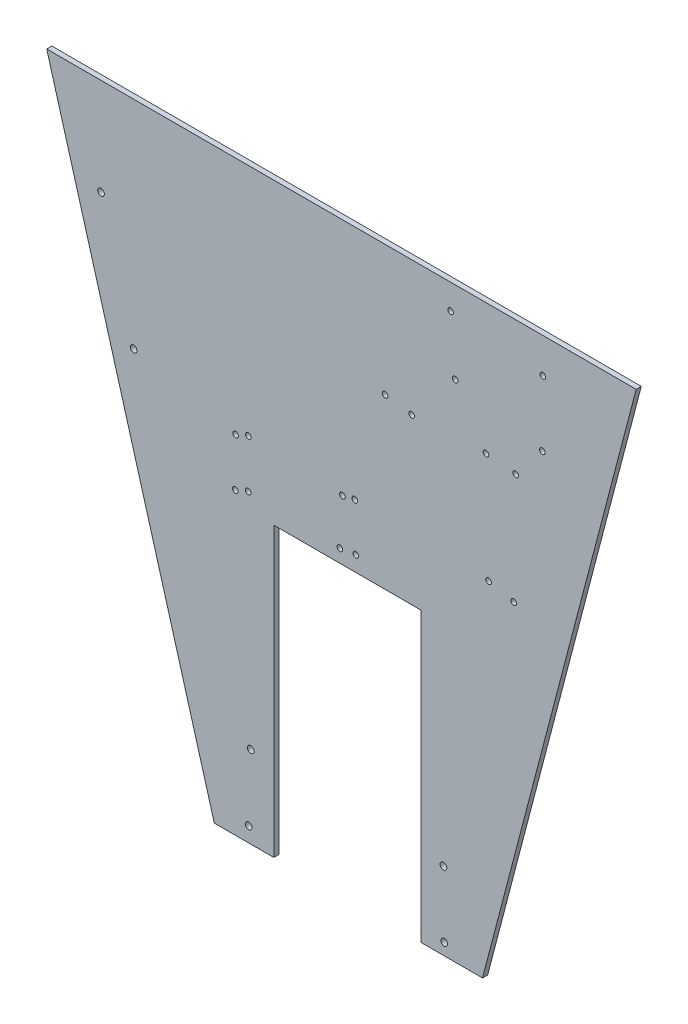
ISO-10303-21;
HEADER;
FILE_DESCRIPTION(('STEP AP214'),'2;1');
FILE_NAME('part.step','',(''),(''),'','','');
FILE_SCHEMA(('AUTOMOTIVE_DESIGN { 1 0 10303 214 1 1 1 1 }'));
ENDSEC;
DATA;
#1=APPLICATION_CONTEXT('core data for automotive mechanical design processes');
#2=APPLICATION_PROTOCOL_DEFINITION('international standard','automotive_design',2000,#1);
#3=PRODUCT_CONTEXT('',#1,'mechanical');
#4=PRODUCT('Part','Part','',(#3));
#5=PRODUCT_RELATED_PRODUCT_CATEGORY('part','',(#4));
#6=PRODUCT_DEFINITION_FORMATION('','',#4);
#7=PRODUCT_DEFINITION_CONTEXT('part definition',#1,'design');
#8=PRODUCT_DEFINITION('design','',#6,#7);
#9=PRODUCT_DEFINITION_SHAPE('','',#8);
#10=(LENGTH_UNIT() NAMED_UNIT(*) SI_UNIT(.MILLI.,.METRE.));
#11=(NAMED_UNIT(*) PLANE_ANGLE_UNIT() SI_UNIT($,.RADIAN.));
#12=(NAMED_UNIT(*) SI_UNIT($,.STERADIAN.) SOLID_ANGLE_UNIT());
#13=UNCERTAINTY_MEASURE_WITH_UNIT(LENGTH_MEASURE(1.E-05),#10,'distance_accuracy_value','');
#14=(GEOMETRIC_REPRESENTATION_CONTEXT(3) GLOBAL_UNCERTAINTY_ASSIGNED_CONTEXT((#13)) GLOBAL_UNIT_ASSIGNED_CONTEXT((#10,
#11,#12)) REPRESENTATION_CONTEXT('',''));
#15=CARTESIAN_POINT('',(0.,0.,0.));
#16=DIRECTION('',(0.,0.,1.));
#17=DIRECTION('',(1.,0.,0.));
#18=AXIS2_PLACEMENT_3D('',#15,#16,#17);
#19=CARTESIAN_POINT('',(0.,0.,5.));
#20=DIRECTION('',(0.,0.,1.));
#21=DIRECTION('',(1.,0.,0.));
#22=AXIS2_PLACEMENT_3D('',#19,#20,#21);
#23=PLANE('',#22);
#24=DIRECTION('',(0.,-1.,0.));
#25=VECTOR('',#24,1.);
#26=CARTESIAN_POINT('',(75.,0.,5.));
#27=LINE('',#26,#25);
#28=CARTESIAN_POINT('',(75.,-81.5,5.));
#29=VERTEX_POINT('',#28);
#30=CARTESIAN_POINT('',(75.,-362.25,5.));
#31=VERTEX_POINT('',#30);
#32=EDGE_CURVE('E91',#29,#31,#27,.T.);
#33=ORIENTED_EDGE('',*,*,#32,.T.);
#34=DIRECTION('',(1.,0.,0.));
#35=VECTOR('',#34,1.);
#36=CARTESIAN_POINT('',(75.,-362.25,5.));
#37=LINE('',#36,#35);
#38=CARTESIAN_POINT('',(135.125,-362.25,5.));
#39=VERTEX_POINT('',#38);
#40=EDGE_CURVE('E95',#31,#39,#37,.T.);
#41=ORIENTED_EDGE('',*,*,#40,.T.);
#42=DIRECTION('',(0.253359391837683,0.967372223380245,0.));
#43=VECTOR('',#42,1.);
#44=CARTESIAN_POINT('',(230.,0.,5.));
#45=LINE('',#44,#43);
#46=CARTESIAN_POINT('',(285.,210.,5.));
#47=VERTEX_POINT('',#46);
#48=EDGE_CURVE('E42',#39,#47,#45,.T.);
#49=ORIENTED_EDGE('',*,*,#48,.T.);
#50=DIRECTION('',(-1.,0.,0.));
#51=VECTOR('',#50,1.);
#52=CARTESIAN_POINT('',(285.,210.,5.));
#53=LINE('',#52,#51);
#54=CARTESIAN_POINT('',(-290.,210.,5.));
#55=VERTEX_POINT('',#54);
#56=EDGE_CURVE('E289',#47,#55,#53,.T.);
#57=ORIENTED_EDGE('',*,*,#56,.T.);
#58=DIRECTION('',(0.274721127897378,-0.961523947640823,0.));
#59=VECTOR('',#58,1.);
#60=CARTESIAN_POINT('',(-212.641509433962,-60.754716981132,5.));
#61=LINE('',#60,#59);
#62=CARTESIAN_POINT('',(-126.5,-362.25,5.));
#63=VERTEX_POINT('',#62);
#64=EDGE_CURVE('E225',#55,#63,#61,.T.);
#65=ORIENTED_EDGE('',*,*,#64,.T.);
#66=DIRECTION('',(1.,0.,0.));
#67=VECTOR('',#66,1.);
#68=CARTESIAN_POINT('',(-126.5,-362.25,5.));
#69=LINE('',#68,#67);
#70=CARTESIAN_POINT('',(-68.5,-362.25,5.));
#71=VERTEX_POINT('',#70);
#72=EDGE_CURVE('E165',#63,#71,#69,.T.);
#73=ORIENTED_EDGE('',*,*,#72,.T.);
#74=DIRECTION('',(0.,-1.,0.));
#75=VECTOR('',#74,1.);
#76=CARTESIAN_POINT('',(-68.5,0.,5.));
#77=LINE('',#76,#75);
#78=CARTESIAN_POINT('',(-68.5,-81.5,5.));
#79=VERTEX_POINT('',#78);
#80=EDGE_CURVE('E180',#79,#71,#77,.T.);
#81=ORIENTED_EDGE('',*,*,#80,.F.);
#82=DIRECTION('',(1.,0.,0.));
#83=VECTOR('',#82,1.);
#84=CARTESIAN_POINT('',(0.,-81.5,5.));
#85=LINE('',#84,#83);
#86=EDGE_CURVE('E99',#79,#29,#85,.T.);
#87=ORIENTED_EDGE('',*,*,#86,.T.);
#88=EDGE_LOOP('',(#33,#41,#49,#57,#65,#73,#81,#87));
#89=FACE_BOUND('',#88,.T.);
#90=CARTESIAN_POINT('',(-1.5,-23.,5.));
#91=DIRECTION('',(0.,0.,1.));
#92=DIRECTION('',(1.,0.,0.));
#93=AXIS2_PLACEMENT_3D('',#90,#91,#92);
#94=CIRCLE('',#93,2.75);
#95=CARTESIAN_POINT('',(1.25,-23.,5.));
#96=VERTEX_POINT('',#95);
#97=EDGE_CURVE('E177',#96,#96,#94,.T.);
#98=ORIENTED_EDGE('',*,*,#97,.F.);
#99=EDGE_LOOP('',(#98));
#100=FACE_BOUND('',#99,.T.);
#101=CARTESIAN_POINT('',(40.,83.,5.));
#102=DIRECTION('',(0.,0.,1.));
#103=DIRECTION('',(1.,0.,0.));
#104=AXIS2_PLACEMENT_3D('',#101,#102,#103);
#105=CIRCLE('',#104,2.75);
#106=CARTESIAN_POINT('',(42.75,83.,5.));
#107=VERTEX_POINT('',#106);
#108=EDGE_CURVE('E247',#107,#107,#105,.T.);
#109=ORIENTED_EDGE('',*,*,#108,.F.);
#110=EDGE_LOOP('',(#109));
#111=FACE_BOUND('',#110,.T.);
#112=CARTESIAN_POINT('',(138.5,82.5,5.));
#113=DIRECTION('',(0.,0.,1.));
#114=DIRECTION('',(1.,0.,0.));
#115=AXIS2_PLACEMENT_3D('',#112,#113,#114);
#116=CIRCLE('',#115,2.75000000000001);
#117=CARTESIAN_POINT('',(141.25,82.5,5.));
#118=VERTEX_POINT('',#117);
#119=EDGE_CURVE('E259',#118,#118,#116,.T.);
#120=ORIENTED_EDGE('',*,*,#119,.F.);
#121=EDGE_LOOP('',(#120));
#122=FACE_BOUND('',#121,.T.);
#123=CARTESIAN_POINT('',(108.5,130.,5.));
#124=DIRECTION('',(0.,0.,1.));
#125=DIRECTION('',(1.,0.,0.));
#126=AXIS2_PLACEMENT_3D('',#123,#124,#125);
#127=CIRCLE('',#126,2.75000000000001);
#128=CARTESIAN_POINT('',(111.25,130.,5.));
#129=VERTEX_POINT('',#128);
#130=EDGE_CURVE('E271',#129,#129,#127,.T.);
#131=ORIENTED_EDGE('',*,*,#130,.F.);
#132=EDGE_LOOP('',(#131));
#133=FACE_BOUND('',#132,.T.);
#134=CARTESIAN_POINT('',(194.,176.,5.));
#135=DIRECTION('',(0.,0.,1.));
#136=DIRECTION('',(1.,0.,0.));
#137=AXIS2_PLACEMENT_3D('',#134,#135,#136);
#138=CIRCLE('',#137,2.75000000000001);
#139=CARTESIAN_POINT('',(196.75,176.,5.));
#140=VERTEX_POINT('',#139);
#141=EDGE_CURVE('E283',#140,#140,#138,.T.);
#142=ORIENTED_EDGE('',*,*,#141,.F.);
#143=EDGE_LOOP('',(#142));
#144=FACE_BOUND('',#143,.T.);
#145=CARTESIAN_POINT('',(-205.214285714286,-1.,5.));
#146=DIRECTION('',(0.,0.,1.));
#147=DIRECTION('',(1.,0.,0.));
#148=AXIS2_PLACEMENT_3D('',#145,#146,#147);
#149=CIRCLE('',#148,3.25000000000001);
#150=CARTESIAN_POINT('',(-201.964285714286,-1.,5.));
#151=VERTEX_POINT('',#150);
#152=EDGE_CURVE('E222',#151,#151,#149,.T.);
#153=ORIENTED_EDGE('',*,*,#152,.F.);
#154=EDGE_LOOP('',(#153));
#155=FACE_BOUND('',#154,.T.);
#156=CARTESIAN_POINT('',(104.,185.5,5.));
#157=DIRECTION('',(0.,0.,1.));
#158=DIRECTION('',(1.,0.,0.));
#159=AXIS2_PLACEMENT_3D('',#156,#157,#158);
#160=CIRCLE('',#159,2.75000000000001);
#161=CARTESIAN_POINT('',(106.75,185.5,5.));
#162=VERTEX_POINT('',#161);
#163=EDGE_CURVE('E277',#162,#162,#160,.T.);
#164=ORIENTED_EDGE('',*,*,#163,.F.);
#165=EDGE_LOOP('',(#164));
#166=FACE_BOUND('',#165,.T.);
#167=CARTESIAN_POINT('',(193.5,112.,5.));
#168=DIRECTION('',(0.,0.,1.));
#169=DIRECTION('',(1.,0.,0.));
#170=AXIS2_PLACEMENT_3D('',#167,#168,#169);
#171=CIRCLE('',#170,2.75000000000001);
#172=CARTESIAN_POINT('',(196.25,112.,5.));
#173=VERTEX_POINT('',#172);
#174=EDGE_CURVE('E265',#173,#173,#171,.T.);
#175=ORIENTED_EDGE('',*,*,#174,.F.);
#176=EDGE_LOOP('',(#175));
#177=FACE_BOUND('',#176,.T.);
#178=CARTESIAN_POINT('',(167.5,79.5,5.));
#179=DIRECTION('',(0.,0.,1.));
#180=DIRECTION('',(1.,0.,0.));
#181=AXIS2_PLACEMENT_3D('',#178,#179,#180);
#182=CIRCLE('',#181,2.75000000000001);
#183=CARTESIAN_POINT('',(170.25,79.5,5.));
#184=VERTEX_POINT('',#183);
#185=EDGE_CURVE('E253',#184,#184,#182,.T.);
#186=ORIENTED_EDGE('',*,*,#185,.F.);
#187=EDGE_LOOP('',(#186));
#188=FACE_BOUND('',#187,.T.);
#189=CARTESIAN_POINT('',(66.,79.,5.));
#190=DIRECTION('',(0.,0.,1.));
#191=DIRECTION('',(1.,0.,0.));
#192=AXIS2_PLACEMENT_3D('',#189,#190,#191);
#193=CIRCLE('',#192,2.75000000000001);
#194=CARTESIAN_POINT('',(68.75,79.,5.));
#195=VERTEX_POINT('',#194);
#196=EDGE_CURVE('E241',#195,#195,#193,.T.);
#197=ORIENTED_EDGE('',*,*,#196,.F.);
#198=EDGE_LOOP('',(#197));
#199=FACE_BOUND('',#198,.T.);
#200=CARTESIAN_POINT('',(-237.,115.5,5.));
#201=DIRECTION('',(0.,0.,1.));
#202=DIRECTION('',(1.,0.,0.));
#203=AXIS2_PLACEMENT_3D('',#200,#201,#202);
#204=CIRCLE('',#203,3.25000000000001);
#205=CARTESIAN_POINT('',(-233.75,115.5,5.));
#206=VERTEX_POINT('',#205);
#207=EDGE_CURVE('E228',#206,#206,#204,.T.);
#208=ORIENTED_EDGE('',*,*,#207,.F.);
#209=EDGE_LOOP('',(#208));
#210=FACE_BOUND('',#209,.T.);
#211=CARTESIAN_POINT('',(-4.,-68.75,5.));
#212=DIRECTION('',(0.,0.,1.));
#213=DIRECTION('',(1.,0.,0.));
#214=AXIS2_PLACEMENT_3D('',#211,#212,#213);
#215=CIRCLE('',#214,2.75);
#216=CARTESIAN_POINT('',(-1.25,-68.75,5.));
#217=VERTEX_POINT('',#216);
#218=EDGE_CURVE('E184',#217,#217,#215,.T.);
#219=ORIENTED_EDGE('',*,*,#218,.F.);
#220=EDGE_LOOP('',(#219));
#221=FACE_BOUND('',#220,.T.);
#222=CARTESIAN_POINT('',(-106.,-70.5,5.));
#223=DIRECTION('',(0.,0.,1.));
#224=DIRECTION('',(1.,0.,0.));
#225=AXIS2_PLACEMENT_3D('',#222,#223,#224);
#226=CIRCLE('',#225,2.75000000000001);
#227=CARTESIAN_POINT('',(-103.25,-70.5,5.));
#228=VERTEX_POINT('',#227);
#229=EDGE_CURVE('E187',#228,#228,#226,.T.);
#230=ORIENTED_EDGE('',*,*,#229,.F.);
#231=EDGE_LOOP('',(#230));
#232=FACE_BOUND('',#231,.T.);
#233=CARTESIAN_POINT('',(-105.75,-23.5,5.));
#234=DIRECTION('',(0.,0.,1.));
#235=DIRECTION('',(1.,0.,0.));
#236=AXIS2_PLACEMENT_3D('',#233,#234,#235);
#237=CIRCLE('',#236,2.75000000000001);
#238=CARTESIAN_POINT('',(-103.,-23.5,5.));
#239=VERTEX_POINT('',#238);
#240=EDGE_CURVE('E190',#239,#239,#237,.T.);
#241=ORIENTED_EDGE('',*,*,#240,.F.);
#242=EDGE_LOOP('',(#241));
#243=FACE_BOUND('',#242,.T.);
#244=CARTESIAN_POINT('',(-93.5,-65.5,5.));
#245=DIRECTION('',(0.,0.,1.));
#246=DIRECTION('',(1.,0.,0.));
#247=AXIS2_PLACEMENT_3D('',#244,#245,#246);
#248=CIRCLE('',#247,2.75000000000001);
#249=CARTESIAN_POINT('',(-90.75,-65.5,5.));
#250=VERTEX_POINT('',#249);
#251=EDGE_CURVE('E193',#250,#250,#248,.T.);
#252=ORIENTED_EDGE('',*,*,#251,.F.);
#253=EDGE_LOOP('',(#252));
#254=FACE_BOUND('',#253,.T.);
#255=CARTESIAN_POINT('',(-93.25,-18.5,5.));
#256=DIRECTION('',(0.,0.,1.));
#257=DIRECTION('',(1.,0.,0.));
#258=AXIS2_PLACEMENT_3D('',#255,#256,#257);
#259=CIRCLE('',#258,2.75000000000001);
#260=CARTESIAN_POINT('',(-90.5,-18.5,5.));
#261=VERTEX_POINT('',#260);
#262=EDGE_CURVE('E196',#261,#261,#259,.T.);
#263=ORIENTED_EDGE('',*,*,#262,.F.);
#264=EDGE_LOOP('',(#263));
#265=FACE_BOUND('',#264,.T.);
#266=CARTESIAN_POINT('',(-91.,-282.25,5.));
#267=DIRECTION('',(0.,0.,1.));
#268=DIRECTION('',(1.,0.,0.));
#269=AXIS2_PLACEMENT_3D('',#266,#267,#268);
#270=CIRCLE('',#269,3.25000000000001);
#271=CARTESIAN_POINT('',(-87.75,-282.25,5.));
#272=VERTEX_POINT('',#271);
#273=EDGE_CURVE('E159',#272,#272,#270,.T.);
#274=ORIENTED_EDGE('',*,*,#273,.F.);
#275=EDGE_LOOP('',(#274));
#276=FACE_BOUND('',#275,.T.);
#277=CARTESIAN_POINT('',(-93.,-347.75,5.));
#278=DIRECTION('',(0.,0.,1.));
#279=DIRECTION('',(1.,0.,0.));
#280=AXIS2_PLACEMENT_3D('',#277,#278,#279);
#281=CIRCLE('',#280,3.25000000000001);
#282=CARTESIAN_POINT('',(-89.75,-347.75,5.));
#283=VERTEX_POINT('',#282);
#284=EDGE_CURVE('E153',#283,#283,#281,.T.);
#285=ORIENTED_EDGE('',*,*,#284,.F.);
#286=EDGE_LOOP('',(#285));
#287=FACE_BOUND('',#286,.T.);
#288=CARTESIAN_POINT('',(165.5,-29.5,5.));
#289=DIRECTION('',(0.,0.,1.));
#290=DIRECTION('',(1.,0.,0.));
#291=AXIS2_PLACEMENT_3D('',#288,#289,#290);
#292=CIRCLE('',#291,2.75000000000001);
#293=CARTESIAN_POINT('',(168.25,-29.5,5.));
#294=VERTEX_POINT('',#293);
#295=EDGE_CURVE('E128',#294,#294,#292,.T.);
#296=ORIENTED_EDGE('',*,*,#295,.F.);
#297=EDGE_LOOP('',(#296));
#298=FACE_BOUND('',#297,.T.);
#299=CARTESIAN_POINT('',(141.,-24.,5.));
#300=DIRECTION('',(0.,0.,1.));
#301=DIRECTION('',(1.,0.,0.));
#302=AXIS2_PLACEMENT_3D('',#299,#300,#301);
#303=CIRCLE('',#302,2.75000000000001);
#304=CARTESIAN_POINT('',(143.75,-24.,5.));
#305=VERTEX_POINT('',#304);
#306=EDGE_CURVE('E131',#305,#305,#303,.T.);
#307=ORIENTED_EDGE('',*,*,#306,.F.);
#308=EDGE_LOOP('',(#307));
#309=FACE_BOUND('',#308,.T.);
#310=CARTESIAN_POINT('',(11.5,-66.5,5.));
#311=DIRECTION('',(0.,0.,1.));
#312=DIRECTION('',(1.,0.,0.));
#313=AXIS2_PLACEMENT_3D('',#310,#311,#312);
#314=CIRCLE('',#313,2.75);
#315=CARTESIAN_POINT('',(14.25,-66.5,5.));
#316=VERTEX_POINT('',#315);
#317=EDGE_CURVE('E134',#316,#316,#314,.T.);
#318=ORIENTED_EDGE('',*,*,#317,.F.);
#319=EDGE_LOOP('',(#318));
#320=FACE_BOUND('',#319,.T.);
#321=CARTESIAN_POINT('',(10.5,-20.5,5.));
#322=DIRECTION('',(0.,0.,1.));
#323=DIRECTION('',(1.,0.,0.));
#324=AXIS2_PLACEMENT_3D('',#321,#322,#323);
#325=CIRCLE('',#324,2.75);
#326=CARTESIAN_POINT('',(13.25,-20.5,5.));
#327=VERTEX_POINT('',#326);
#328=EDGE_CURVE('E104',#327,#327,#325,.T.);
#329=ORIENTED_EDGE('',*,*,#328,.F.);
#330=EDGE_LOOP('',(#329));
#331=FACE_BOUND('',#330,.T.);
#332=CARTESIAN_POINT('',(97.75,-350.75,5.));
#333=DIRECTION('',(0.,0.,1.));
#334=DIRECTION('',(1.,0.,0.));
#335=AXIS2_PLACEMENT_3D('',#332,#333,#334);
#336=CIRCLE('',#335,3.25000000000001);
#337=CARTESIAN_POINT('',(101.,-350.75,5.));
#338=VERTEX_POINT('',#337);
#339=EDGE_CURVE('E122',#338,#338,#336,.T.);
#340=ORIENTED_EDGE('',*,*,#339,.F.);
#341=EDGE_LOOP('',(#340));
#342=FACE_BOUND('',#341,.T.);
#343=CARTESIAN_POINT('',(97.,-286.75,5.));
#344=DIRECTION('',(0.,0.,1.));
#345=DIRECTION('',(1.,0.,0.));
#346=AXIS2_PLACEMENT_3D('',#343,#344,#345);
#347=CIRCLE('',#346,3.25000000000001);
#348=CARTESIAN_POINT('',(100.25,-286.75,5.));
#349=VERTEX_POINT('',#348);
#350=EDGE_CURVE('E480',#349,#349,#347,.T.);
#351=ORIENTED_EDGE('',*,*,#350,.F.);
#352=EDGE_LOOP('',(#351));
#353=FACE_BOUND('',#352,.T.);
#354=ADVANCED_FACE('F33',(#89,#100,#111,#122,#133,#144,#155,#166,#177,#188,#199,#210,#221,#232,
#243,#254,#265,#276,#287,#298,#309,#320,#331,#342,#353),#23,.T.);
#355=CARTESIAN_POINT('',(0.,0.,0.));
#356=DIRECTION('',(0.,0.,1.));
#357=DIRECTION('',(1.,0.,0.));
#358=AXIS2_PLACEMENT_3D('',#355,#356,#357);
#359=PLANE('',#358);
#360=DIRECTION('',(0.253359391837683,0.967372223380245,0.));
#361=VECTOR('',#360,1.);
#362=CARTESIAN_POINT('',(230.,0.,0.));
#363=LINE('',#362,#361);
#364=CARTESIAN_POINT('',(135.125,-362.25,0.));
#365=VERTEX_POINT('',#364);
#366=CARTESIAN_POINT('',(285.,210.,0.));
#367=VERTEX_POINT('',#366);
#368=EDGE_CURVE('E291',#365,#367,#363,.T.);
#369=ORIENTED_EDGE('',*,*,#368,.F.);
#370=DIRECTION('',(1.,0.,0.));
#371=VECTOR('',#370,1.);
#372=CARTESIAN_POINT('',(75.,-362.25,0.));
#373=LINE('',#372,#371);
#374=CARTESIAN_POINT('',(75.,-362.25,0.));
#375=VERTEX_POINT('',#374);
#376=EDGE_CURVE('E119',#375,#365,#373,.T.);
#377=ORIENTED_EDGE('',*,*,#376,.F.);
#378=DIRECTION('',(0.,-1.,0.));
#379=VECTOR('',#378,1.);
#380=CARTESIAN_POINT('',(75.,0.,0.));
#381=LINE('',#380,#379);
#382=CARTESIAN_POINT('',(75.,-81.5,0.));
#383=VERTEX_POINT('',#382);
#384=EDGE_CURVE('E110',#383,#375,#381,.T.);
#385=ORIENTED_EDGE('',*,*,#384,.F.);
#386=DIRECTION('',(1.,0.,0.));
#387=VECTOR('',#386,1.);
#388=CARTESIAN_POINT('',(0.,-81.5,0.));
#389=LINE('',#388,#387);
#390=CARTESIAN_POINT('',(-68.5,-81.5,0.));
#391=VERTEX_POINT('',#390);
#392=EDGE_CURVE('E204',#391,#383,#389,.T.);
#393=ORIENTED_EDGE('',*,*,#392,.F.);
#394=DIRECTION('',(0.,-1.,0.));
#395=VECTOR('',#394,1.);
#396=CARTESIAN_POINT('',(-68.5,0.,0.));
#397=LINE('',#396,#395);
#398=CARTESIAN_POINT('',(-68.5,-362.25,0.));
#399=VERTEX_POINT('',#398);
#400=EDGE_CURVE('E202',#391,#399,#397,.T.);
#401=ORIENTED_EDGE('',*,*,#400,.T.);
#402=DIRECTION('',(1.,0.,0.));
#403=VECTOR('',#402,1.);
#404=CARTESIAN_POINT('',(-126.5,-362.25,0.));
#405=LINE('',#404,#403);
#406=CARTESIAN_POINT('',(-126.5,-362.25,0.));
#407=VERTEX_POINT('',#406);
#408=EDGE_CURVE('E162',#407,#399,#405,.T.);
#409=ORIENTED_EDGE('',*,*,#408,.F.);
#410=DIRECTION('',(0.274721127897378,-0.961523947640823,0.));
#411=VECTOR('',#410,1.);
#412=CARTESIAN_POINT('',(-212.641509433962,-60.754716981132,0.));
#413=LINE('',#412,#411);
#414=CARTESIAN_POINT('',(-290.,210.,0.));
#415=VERTEX_POINT('',#414);
#416=EDGE_CURVE('E234',#415,#407,#413,.T.);
#417=ORIENTED_EDGE('',*,*,#416,.F.);
#418=DIRECTION('',(-1.,0.,0.));
#419=VECTOR('',#418,1.);
#420=CARTESIAN_POINT('',(285.,210.,0.));
#421=LINE('',#420,#419);
#422=EDGE_CURVE('E286',#367,#415,#421,.T.);
#423=ORIENTED_EDGE('',*,*,#422,.F.);
#424=EDGE_LOOP('',(#369,#377,#385,#393,#401,#409,#417,#423));
#425=FACE_BOUND('',#424,.T.);
#426=CARTESIAN_POINT('',(-1.5,-23.,0.));
#427=DIRECTION('',(0.,0.,1.));
#428=DIRECTION('',(1.,0.,0.));
#429=AXIS2_PLACEMENT_3D('',#426,#427,#428);
#430=CIRCLE('',#429,2.75);
#431=CARTESIAN_POINT('',(1.25,-23.,0.));
#432=VERTEX_POINT('',#431);
#433=EDGE_CURVE('E176',#432,#432,#430,.T.);
#434=ORIENTED_EDGE('',*,*,#433,.T.);
#435=EDGE_LOOP('',(#434));
#436=FACE_BOUND('',#435,.T.);
#437=CARTESIAN_POINT('',(-205.214285714286,-1.,0.));
#438=DIRECTION('',(0.,0.,1.));
#439=DIRECTION('',(1.,0.,0.));
#440=AXIS2_PLACEMENT_3D('',#437,#438,#439);
#441=CIRCLE('',#440,3.25000000000001);
#442=CARTESIAN_POINT('',(-201.964285714286,-1.,0.));
#443=VERTEX_POINT('',#442);
#444=EDGE_CURVE('E221',#443,#443,#441,.T.);
#445=ORIENTED_EDGE('',*,*,#444,.T.);
#446=EDGE_LOOP('',(#445));
#447=FACE_BOUND('',#446,.T.);
#448=CARTESIAN_POINT('',(194.,176.,0.));
#449=DIRECTION('',(0.,0.,1.));
#450=DIRECTION('',(1.,0.,0.));
#451=AXIS2_PLACEMENT_3D('',#448,#449,#450);
#452=CIRCLE('',#451,2.75000000000001);
#453=CARTESIAN_POINT('',(196.75,176.,0.));
#454=VERTEX_POINT('',#453);
#455=EDGE_CURVE('E280',#454,#454,#452,.T.);
#456=ORIENTED_EDGE('',*,*,#455,.T.);
#457=EDGE_LOOP('',(#456));
#458=FACE_BOUND('',#457,.T.);
#459=CARTESIAN_POINT('',(104.,185.5,0.));
#460=DIRECTION('',(0.,0.,1.));
#461=DIRECTION('',(1.,0.,0.));
#462=AXIS2_PLACEMENT_3D('',#459,#460,#461);
#463=CIRCLE('',#462,2.75000000000001);
#464=CARTESIAN_POINT('',(106.75,185.5,0.));
#465=VERTEX_POINT('',#464);
#466=EDGE_CURVE('E274',#465,#465,#463,.T.);
#467=ORIENTED_EDGE('',*,*,#466,.T.);
#468=EDGE_LOOP('',(#467));
#469=FACE_BOUND('',#468,.T.);
#470=CARTESIAN_POINT('',(108.5,130.,0.));
#471=DIRECTION('',(0.,0.,1.));
#472=DIRECTION('',(1.,0.,0.));
#473=AXIS2_PLACEMENT_3D('',#470,#471,#472);
#474=CIRCLE('',#473,2.75000000000001);
#475=CARTESIAN_POINT('',(111.25,130.,0.));
#476=VERTEX_POINT('',#475);
#477=EDGE_CURVE('E268',#476,#476,#474,.T.);
#478=ORIENTED_EDGE('',*,*,#477,.T.);
#479=EDGE_LOOP('',(#478));
#480=FACE_BOUND('',#479,.T.);
#481=CARTESIAN_POINT('',(193.5,112.,0.));
#482=DIRECTION('',(0.,0.,1.));
#483=DIRECTION('',(1.,0.,0.));
#484=AXIS2_PLACEMENT_3D('',#481,#482,#483);
#485=CIRCLE('',#484,2.75000000000001);
#486=CARTESIAN_POINT('',(196.25,112.,0.));
#487=VERTEX_POINT('',#486);
#488=EDGE_CURVE('E262',#487,#487,#485,.T.);
#489=ORIENTED_EDGE('',*,*,#488,.T.);
#490=EDGE_LOOP('',(#489));
#491=FACE_BOUND('',#490,.T.);
#492=CARTESIAN_POINT('',(138.5,82.5,0.));
#493=DIRECTION('',(0.,0.,1.));
#494=DIRECTION('',(1.,0.,0.));
#495=AXIS2_PLACEMENT_3D('',#492,#493,#494);
#496=CIRCLE('',#495,2.75000000000001);
#497=CARTESIAN_POINT('',(141.25,82.5,0.));
#498=VERTEX_POINT('',#497);
#499=EDGE_CURVE('E256',#498,#498,#496,.T.);
#500=ORIENTED_EDGE('',*,*,#499,.T.);
#501=EDGE_LOOP('',(#500));
#502=FACE_BOUND('',#501,.T.);
#503=CARTESIAN_POINT('',(167.5,79.5,0.));
#504=DIRECTION('',(0.,0.,1.));
#505=DIRECTION('',(1.,0.,0.));
#506=AXIS2_PLACEMENT_3D('',#503,#504,#505);
#507=CIRCLE('',#506,2.75000000000001);
#508=CARTESIAN_POINT('',(170.25,79.5,0.));
#509=VERTEX_POINT('',#508);
#510=EDGE_CURVE('E250',#509,#509,#507,.T.);
#511=ORIENTED_EDGE('',*,*,#510,.T.);
#512=EDGE_LOOP('',(#511));
#513=FACE_BOUND('',#512,.T.);
#514=CARTESIAN_POINT('',(40.,83.,0.));
#515=DIRECTION('',(0.,0.,1.));
#516=DIRECTION('',(1.,0.,0.));
#517=AXIS2_PLACEMENT_3D('',#514,#515,#516);
#518=CIRCLE('',#517,2.75);
#519=CARTESIAN_POINT('',(42.75,83.,0.));
#520=VERTEX_POINT('',#519);
#521=EDGE_CURVE('E244',#520,#520,#518,.T.);
#522=ORIENTED_EDGE('',*,*,#521,.T.);
#523=EDGE_LOOP('',(#522));
#524=FACE_BOUND('',#523,.T.);
#525=CARTESIAN_POINT('',(66.,79.,0.));
#526=DIRECTION('',(0.,0.,1.));
#527=DIRECTION('',(1.,0.,0.));
#528=AXIS2_PLACEMENT_3D('',#525,#526,#527);
#529=CIRCLE('',#528,2.75000000000001);
#530=CARTESIAN_POINT('',(68.75,79.,0.));
#531=VERTEX_POINT('',#530);
#532=EDGE_CURVE('E240',#531,#531,#529,.T.);
#533=ORIENTED_EDGE('',*,*,#532,.T.);
#534=EDGE_LOOP('',(#533));
#535=FACE_BOUND('',#534,.T.);
#536=CARTESIAN_POINT('',(-237.,115.5,0.));
#537=DIRECTION('',(0.,0.,1.));
#538=DIRECTION('',(1.,0.,0.));
#539=AXIS2_PLACEMENT_3D('',#536,#537,#538);
#540=CIRCLE('',#539,3.25000000000001);
#541=CARTESIAN_POINT('',(-233.75,115.5,0.));
#542=VERTEX_POINT('',#541);
#543=EDGE_CURVE('E226',#542,#542,#540,.T.);
#544=ORIENTED_EDGE('',*,*,#543,.T.);
#545=EDGE_LOOP('',(#544));
#546=FACE_BOUND('',#545,.T.);
#547=CARTESIAN_POINT('',(-4.,-68.75,0.));
#548=DIRECTION('',(0.,0.,1.));
#549=DIRECTION('',(1.,0.,0.));
#550=AXIS2_PLACEMENT_3D('',#547,#548,#549);
#551=CIRCLE('',#550,2.75);
#552=CARTESIAN_POINT('',(-1.25,-68.75,0.));
#553=VERTEX_POINT('',#552);
#554=EDGE_CURVE('E206',#553,#553,#551,.T.);
#555=ORIENTED_EDGE('',*,*,#554,.T.);
#556=EDGE_LOOP('',(#555));
#557=FACE_BOUND('',#556,.T.);
#558=CARTESIAN_POINT('',(-106.,-70.5,0.));
#559=DIRECTION('',(0.,0.,1.));
#560=DIRECTION('',(1.,0.,0.));
#561=AXIS2_PLACEMENT_3D('',#558,#559,#560);
#562=CIRCLE('',#561,2.75000000000001);
#563=CARTESIAN_POINT('',(-103.25,-70.5,0.));
#564=VERTEX_POINT('',#563);
#565=EDGE_CURVE('E209',#564,#564,#562,.T.);
#566=ORIENTED_EDGE('',*,*,#565,.T.);
#567=EDGE_LOOP('',(#566));
#568=FACE_BOUND('',#567,.T.);
#569=CARTESIAN_POINT('',(-105.75,-23.5,0.));
#570=DIRECTION('',(0.,0.,1.));
#571=DIRECTION('',(1.,0.,0.));
#572=AXIS2_PLACEMENT_3D('',#569,#570,#571);
#573=CIRCLE('',#572,2.75000000000001);
#574=CARTESIAN_POINT('',(-103.,-23.5,0.));
#575=VERTEX_POINT('',#574);
#576=EDGE_CURVE('E212',#575,#575,#573,.T.);
#577=ORIENTED_EDGE('',*,*,#576,.T.);
#578=EDGE_LOOP('',(#577));
#579=FACE_BOUND('',#578,.T.);
#580=CARTESIAN_POINT('',(-93.5,-65.5,0.));
#581=DIRECTION('',(0.,0.,1.));
#582=DIRECTION('',(1.,0.,0.));
#583=AXIS2_PLACEMENT_3D('',#580,#581,#582);
#584=CIRCLE('',#583,2.75000000000001);
#585=CARTESIAN_POINT('',(-90.75,-65.5,0.));
#586=VERTEX_POINT('',#585);
#587=EDGE_CURVE('E215',#586,#586,#584,.T.);
#588=ORIENTED_EDGE('',*,*,#587,.T.);
#589=EDGE_LOOP('',(#588));
#590=FACE_BOUND('',#589,.T.);
#591=CARTESIAN_POINT('',(-93.25,-18.5,0.));
#592=DIRECTION('',(0.,0.,1.));
#593=DIRECTION('',(1.,0.,0.));
#594=AXIS2_PLACEMENT_3D('',#591,#592,#593);
#595=CIRCLE('',#594,2.75000000000001);
#596=CARTESIAN_POINT('',(-90.5,-18.5,0.));
#597=VERTEX_POINT('',#596);
#598=EDGE_CURVE('E181',#597,#597,#595,.T.);
#599=ORIENTED_EDGE('',*,*,#598,.T.);
#600=EDGE_LOOP('',(#599));
#601=FACE_BOUND('',#600,.T.);
#602=CARTESIAN_POINT('',(-91.,-282.25,0.));
#603=DIRECTION('',(0.,0.,1.));
#604=DIRECTION('',(1.,0.,0.));
#605=AXIS2_PLACEMENT_3D('',#602,#603,#604);
#606=CIRCLE('',#605,3.25000000000001);
#607=CARTESIAN_POINT('',(-87.75,-282.25,0.));
#608=VERTEX_POINT('',#607);
#609=EDGE_CURVE('E156',#608,#608,#606,.T.);
#610=ORIENTED_EDGE('',*,*,#609,.T.);
#611=EDGE_LOOP('',(#610));
#612=FACE_BOUND('',#611,.T.);
#613=CARTESIAN_POINT('',(-93.,-347.75,0.));
#614=DIRECTION('',(0.,0.,1.));
#615=DIRECTION('',(1.,0.,0.));
#616=AXIS2_PLACEMENT_3D('',#613,#614,#615);
#617=CIRCLE('',#616,3.25000000000001);
#618=CARTESIAN_POINT('',(-89.75,-347.75,0.));
#619=VERTEX_POINT('',#618);
#620=EDGE_CURVE('E152',#619,#619,#617,.T.);
#621=ORIENTED_EDGE('',*,*,#620,.T.);
#622=EDGE_LOOP('',(#621));
#623=FACE_BOUND('',#622,.T.);
#624=CARTESIAN_POINT('',(165.5,-29.5,0.));
#625=DIRECTION('',(0.,0.,1.));
#626=DIRECTION('',(1.,0.,0.));
#627=AXIS2_PLACEMENT_3D('',#624,#625,#626);
#628=CIRCLE('',#627,2.75000000000001);
#629=CARTESIAN_POINT('',(168.25,-29.5,0.));
#630=VERTEX_POINT('',#629);
#631=EDGE_CURVE('E114',#630,#630,#628,.T.);
#632=ORIENTED_EDGE('',*,*,#631,.T.);
#633=EDGE_LOOP('',(#632));
#634=FACE_BOUND('',#633,.T.);
#635=CARTESIAN_POINT('',(141.,-24.,0.));
#636=DIRECTION('',(0.,0.,1.));
#637=DIRECTION('',(1.,0.,0.));
#638=AXIS2_PLACEMENT_3D('',#635,#636,#637);
#639=CIRCLE('',#638,2.75000000000001);
#640=CARTESIAN_POINT('',(143.75,-24.,0.));
#641=VERTEX_POINT('',#640);
#642=EDGE_CURVE('E141',#641,#641,#639,.T.);
#643=ORIENTED_EDGE('',*,*,#642,.T.);
#644=EDGE_LOOP('',(#643));
#645=FACE_BOUND('',#644,.T.);
#646=CARTESIAN_POINT('',(11.5,-66.5,0.));
#647=DIRECTION('',(0.,0.,1.));
#648=DIRECTION('',(1.,0.,0.));
#649=AXIS2_PLACEMENT_3D('',#646,#647,#648);
#650=CIRCLE('',#649,2.75);
#651=CARTESIAN_POINT('',(14.25,-66.5,0.));
#652=VERTEX_POINT('',#651);
#653=EDGE_CURVE('E144',#652,#652,#650,.T.);
#654=ORIENTED_EDGE('',*,*,#653,.T.);
#655=EDGE_LOOP('',(#654));
#656=FACE_BOUND('',#655,.T.);
#657=CARTESIAN_POINT('',(10.5,-20.5,0.));
#658=DIRECTION('',(0.,0.,1.));
#659=DIRECTION('',(1.,0.,0.));
#660=AXIS2_PLACEMENT_3D('',#657,#658,#659);
#661=CIRCLE('',#660,2.75);
#662=CARTESIAN_POINT('',(13.25,-20.5,0.));
#663=VERTEX_POINT('',#662);
#664=EDGE_CURVE('E147',#663,#663,#661,.T.);
#665=ORIENTED_EDGE('',*,*,#664,.T.);
#666=EDGE_LOOP('',(#665));
#667=FACE_BOUND('',#666,.T.);
#668=CARTESIAN_POINT('',(97.75,-350.75,0.));
#669=DIRECTION('',(0.,0.,1.));
#670=DIRECTION('',(1.,0.,0.));
#671=AXIS2_PLACEMENT_3D('',#668,#669,#670);
#672=CIRCLE('',#671,3.25000000000001);
#673=CARTESIAN_POINT('',(101.,-350.75,0.));
#674=VERTEX_POINT('',#673);
#675=EDGE_CURVE('E125',#674,#674,#672,.T.);
#676=ORIENTED_EDGE('',*,*,#675,.T.);
#677=EDGE_LOOP('',(#676));
#678=FACE_BOUND('',#677,.T.);
#679=CARTESIAN_POINT('',(97.,-286.75,0.));
#680=DIRECTION('',(0.,0.,1.));
#681=DIRECTION('',(1.,0.,0.));
#682=AXIS2_PLACEMENT_3D('',#679,#680,#681);
#683=CIRCLE('',#682,3.25000000000001);
#684=CARTESIAN_POINT('',(100.25,-286.75,0.));
#685=VERTEX_POINT('',#684);
#686=EDGE_CURVE('E479',#685,#685,#683,.T.);
#687=ORIENTED_EDGE('',*,*,#686,.T.);
#688=EDGE_LOOP('',(#687));
#689=FACE_BOUND('',#688,.T.);
#690=ADVANCED_FACE('F301',(#425,#436,#447,#458,#469,#480,#491,#502,#513,#524,#535,#546,#557,
#568,#579,#590,#601,#612,#623,#634,#645,#656,#667,#678,#689),#359,.F.);
#691=CARTESIAN_POINT('',(285.,210.,5.));
#692=DIRECTION('',(0.,-1.,0.));
#693=DIRECTION('',(1.,0.,0.));
#694=AXIS2_PLACEMENT_3D('',#691,#692,#693);
#695=PLANE('',#694);
#696=ORIENTED_EDGE('',*,*,#422,.T.);
#697=DIRECTION('',(0.,0.,-1.));
#698=VECTOR('',#697,1.);
#699=CARTESIAN_POINT('',(-290.,210.,5.));
#700=LINE('',#699,#698);
#701=EDGE_CURVE('E231',#55,#415,#700,.T.);
#702=ORIENTED_EDGE('',*,*,#701,.F.);
#703=ORIENTED_EDGE('',*,*,#56,.F.);
#704=DIRECTION('',(0.,0.,-1.));
#705=VECTOR('',#704,1.);
#706=CARTESIAN_POINT('',(285.,210.,5.));
#707=LINE('',#706,#705);
#708=EDGE_CURVE('E11',#47,#367,#707,.T.);
#709=ORIENTED_EDGE('',*,*,#708,.T.);
#710=EDGE_LOOP('',(#696,#702,#703,#709));
#711=FACE_BOUND('',#710,.T.);
#712=ADVANCED_FACE('F35',(#711),#695,.F.);
#713=CARTESIAN_POINT('',(230.,0.,5.));
#714=DIRECTION('',(-0.967372223380245,0.253359391837683,0.));
#715=DIRECTION('',(-0.253359391837683,-0.967372223380245,0.));
#716=AXIS2_PLACEMENT_3D('',#713,#714,#715);
#717=PLANE('',#716);
#718=ORIENTED_EDGE('',*,*,#368,.T.);
#719=ORIENTED_EDGE('',*,*,#708,.F.);
#720=ORIENTED_EDGE('',*,*,#48,.F.);
#721=DIRECTION('',(0.,0.,-1.));
#722=VECTOR('',#721,1.);
#723=CARTESIAN_POINT('',(135.125,-362.25,5.));
#724=LINE('',#723,#722);
#725=EDGE_CURVE('E115',#39,#365,#724,.T.);
#726=ORIENTED_EDGE('',*,*,#725,.T.);
#727=EDGE_LOOP('',(#718,#719,#720,#726));
#728=FACE_BOUND('',#727,.T.);
#729=ADVANCED_FACE('F294',(#728),#717,.F.);
#730=CARTESIAN_POINT('',(194.,176.,5.));
#731=DIRECTION('',(0.,0.,-1.));
#732=DIRECTION('',(-1.,0.,0.));
#733=AXIS2_PLACEMENT_3D('',#730,#731,#732);
#734=CYLINDRICAL_SURFACE('',#733,2.75000000000001);
#735=ORIENTED_EDGE('',*,*,#141,.T.);
#736=EDGE_LOOP('',(#735));
#737=FACE_BOUND('',#736,.T.);
#738=ORIENTED_EDGE('',*,*,#455,.F.);
#739=EDGE_LOOP('',(#738));
#740=FACE_BOUND('',#739,.T.);
#741=ADVANCED_FACE('F338',(#737,#740),#734,.F.);
#742=CARTESIAN_POINT('',(104.,185.5,5.));
#743=DIRECTION('',(0.,0.,-1.));
#744=DIRECTION('',(-1.,0.,0.));
#745=AXIS2_PLACEMENT_3D('',#742,#743,#744);
#746=CYLINDRICAL_SURFACE('',#745,2.75000000000001);
#747=ORIENTED_EDGE('',*,*,#163,.T.);
#748=EDGE_LOOP('',(#747));
#749=FACE_BOUND('',#748,.T.);
#750=ORIENTED_EDGE('',*,*,#466,.F.);
#751=EDGE_LOOP('',(#750));
#752=FACE_BOUND('',#751,.T.);
#753=ADVANCED_FACE('F345',(#749,#752),#746,.F.);
#754=CARTESIAN_POINT('',(108.5,130.,5.));
#755=DIRECTION('',(0.,0.,-1.));
#756=DIRECTION('',(-1.,0.,0.));
#757=AXIS2_PLACEMENT_3D('',#754,#755,#756);
#758=CYLINDRICAL_SURFACE('',#757,2.75000000000001);
#759=ORIENTED_EDGE('',*,*,#130,.T.);
#760=EDGE_LOOP('',(#759));
#761=FACE_BOUND('',#760,.T.);
#762=ORIENTED_EDGE('',*,*,#477,.F.);
#763=EDGE_LOOP('',(#762));
#764=FACE_BOUND('',#763,.T.);
#765=ADVANCED_FACE('F620',(#761,#764),#758,.F.);
#766=CARTESIAN_POINT('',(193.5,112.,5.));
#767=DIRECTION('',(0.,0.,-1.));
#768=DIRECTION('',(-1.,0.,0.));
#769=AXIS2_PLACEMENT_3D('',#766,#767,#768);
#770=CYLINDRICAL_SURFACE('',#769,2.75000000000001);
#771=ORIENTED_EDGE('',*,*,#174,.T.);
#772=EDGE_LOOP('',(#771));
#773=FACE_BOUND('',#772,.T.);
#774=ORIENTED_EDGE('',*,*,#488,.F.);
#775=EDGE_LOOP('',(#774));
#776=FACE_BOUND('',#775,.T.);
#777=ADVANCED_FACE('F628',(#773,#776),#770,.F.);
#778=CARTESIAN_POINT('',(138.5,82.5,5.));
#779=DIRECTION('',(0.,0.,-1.));
#780=DIRECTION('',(-1.,0.,0.));
#781=AXIS2_PLACEMENT_3D('',#778,#779,#780);
#782=CYLINDRICAL_SURFACE('',#781,2.75000000000001);
#783=ORIENTED_EDGE('',*,*,#119,.T.);
#784=EDGE_LOOP('',(#783));
#785=FACE_BOUND('',#784,.T.);
#786=ORIENTED_EDGE('',*,*,#499,.F.);
#787=EDGE_LOOP('',(#786));
#788=FACE_BOUND('',#787,.T.);
#789=ADVANCED_FACE('F637',(#785,#788),#782,.F.);
#790=CARTESIAN_POINT('',(167.5,79.5,5.));
#791=DIRECTION('',(0.,0.,-1.));
#792=DIRECTION('',(-1.,0.,0.));
#793=AXIS2_PLACEMENT_3D('',#790,#791,#792);
#794=CYLINDRICAL_SURFACE('',#793,2.75000000000001);
#795=ORIENTED_EDGE('',*,*,#185,.T.);
#796=EDGE_LOOP('',(#795));
#797=FACE_BOUND('',#796,.T.);
#798=ORIENTED_EDGE('',*,*,#510,.F.);
#799=EDGE_LOOP('',(#798));
#800=FACE_BOUND('',#799,.T.);
#801=ADVANCED_FACE('F646',(#797,#800),#794,.F.);
#802=CARTESIAN_POINT('',(40.,83.,5.));
#803=DIRECTION('',(0.,0.,-1.));
#804=DIRECTION('',(-1.,0.,0.));
#805=AXIS2_PLACEMENT_3D('',#802,#803,#804);
#806=CYLINDRICAL_SURFACE('',#805,2.75);
#807=ORIENTED_EDGE('',*,*,#108,.T.);
#808=EDGE_LOOP('',(#807));
#809=FACE_BOUND('',#808,.T.);
#810=ORIENTED_EDGE('',*,*,#521,.F.);
#811=EDGE_LOOP('',(#810));
#812=FACE_BOUND('',#811,.T.);
#813=ADVANCED_FACE('F655',(#809,#812),#806,.F.);
#814=CARTESIAN_POINT('',(66.,79.,5.));
#815=DIRECTION('',(0.,0.,-1.));
#816=DIRECTION('',(-1.,0.,0.));
#817=AXIS2_PLACEMENT_3D('',#814,#815,#816);
#818=CYLINDRICAL_SURFACE('',#817,2.75000000000001);
#819=ORIENTED_EDGE('',*,*,#196,.T.);
#820=EDGE_LOOP('',(#819));
#821=FACE_BOUND('',#820,.T.);
#822=ORIENTED_EDGE('',*,*,#532,.F.);
#823=EDGE_LOOP('',(#822));
#824=FACE_BOUND('',#823,.T.);
#825=ADVANCED_FACE('F664',(#821,#824),#818,.F.);
#826=CARTESIAN_POINT('',(-205.214285714286,-1.,5.));
#827=DIRECTION('',(0.,0.,-1.));
#828=DIRECTION('',(-1.,0.,0.));
#829=AXIS2_PLACEMENT_3D('',#826,#827,#828);
#830=CYLINDRICAL_SURFACE('',#829,3.25000000000001);
#831=ORIENTED_EDGE('',*,*,#444,.F.);
#832=EDGE_LOOP('',(#831));
#833=FACE_BOUND('',#832,.T.);
#834=ORIENTED_EDGE('',*,*,#152,.T.);
#835=EDGE_LOOP('',(#834));
#836=FACE_BOUND('',#835,.T.);
#837=ADVANCED_FACE('F672',(#833,#836),#830,.F.);
#838=CARTESIAN_POINT('',(-212.641509433962,-60.754716981132,5.));
#839=DIRECTION('',(0.961523947640823,0.274721127897378,0.));
#840=DIRECTION('',(-0.274721127897378,0.961523947640823,0.));
#841=AXIS2_PLACEMENT_3D('',#838,#839,#840);
#842=PLANE('',#841);
#843=ORIENTED_EDGE('',*,*,#416,.T.);
#844=DIRECTION('',(0.,0.,-1.));
#845=VECTOR('',#844,1.);
#846=CARTESIAN_POINT('',(-126.5,-362.25,5.));
#847=LINE('',#846,#845);
#848=EDGE_CURVE('E173',#63,#407,#847,.T.);
#849=ORIENTED_EDGE('',*,*,#848,.F.);
#850=ORIENTED_EDGE('',*,*,#64,.F.);
#851=ORIENTED_EDGE('',*,*,#701,.T.);
#852=EDGE_LOOP('',(#843,#849,#850,#851));
#853=FACE_BOUND('',#852,.T.);
#854=ADVANCED_FACE('F306',(#853),#842,.F.);
#855=CARTESIAN_POINT('',(-237.,115.5,5.));
#856=DIRECTION('',(0.,0.,-1.));
#857=DIRECTION('',(-1.,0.,0.));
#858=AXIS2_PLACEMENT_3D('',#855,#856,#857);
#859=CYLINDRICAL_SURFACE('',#858,3.25000000000001);
#860=ORIENTED_EDGE('',*,*,#207,.T.);
#861=EDGE_LOOP('',(#860));
#862=FACE_BOUND('',#861,.T.);
#863=ORIENTED_EDGE('',*,*,#543,.F.);
#864=EDGE_LOOP('',(#863));
#865=FACE_BOUND('',#864,.T.);
#866=ADVANCED_FACE('F549',(#862,#865),#859,.F.);
#867=CARTESIAN_POINT('',(-1.5,-23.,5.));
#868=DIRECTION('',(0.,0.,-1.));
#869=DIRECTION('',(-1.,0.,0.));
#870=AXIS2_PLACEMENT_3D('',#867,#868,#869);
#871=CYLINDRICAL_SURFACE('',#870,2.75);
#872=ORIENTED_EDGE('',*,*,#433,.F.);
#873=EDGE_LOOP('',(#872));
#874=FACE_BOUND('',#873,.T.);
#875=ORIENTED_EDGE('',*,*,#97,.T.);
#876=EDGE_LOOP('',(#875));
#877=FACE_BOUND('',#876,.T.);
#878=ADVANCED_FACE('F328',(#874,#877),#871,.F.);
#879=CARTESIAN_POINT('',(-68.5,0.,5.));
#880=DIRECTION('',(1.,0.,0.));
#881=DIRECTION('',(0.,1.,0.));
#882=AXIS2_PLACEMENT_3D('',#879,#880,#881);
#883=PLANE('',#882);
#884=ORIENTED_EDGE('',*,*,#400,.F.);
#885=DIRECTION('',(0.,0.,-1.));
#886=VECTOR('',#885,1.);
#887=CARTESIAN_POINT('',(-68.5,-81.5,5.));
#888=LINE('',#887,#886);
#889=EDGE_CURVE('E199',#79,#391,#888,.T.);
#890=ORIENTED_EDGE('',*,*,#889,.F.);
#891=ORIENTED_EDGE('',*,*,#80,.T.);
#892=DIRECTION('',(0.,0.,-1.));
#893=VECTOR('',#892,1.);
#894=CARTESIAN_POINT('',(-68.5,-362.25,5.));
#895=LINE('',#894,#893);
#896=EDGE_CURVE('E168',#71,#399,#895,.T.);
#897=ORIENTED_EDGE('',*,*,#896,.T.);
#898=EDGE_LOOP('',(#884,#890,#891,#897));
#899=FACE_BOUND('',#898,.T.);
#900=ADVANCED_FACE('F314',(#899),#883,.T.);
#901=CARTESIAN_POINT('',(0.,-81.5,5.));
#902=DIRECTION('',(0.,1.,0.));
#903=DIRECTION('',(0.,0.,1.));
#904=AXIS2_PLACEMENT_3D('',#901,#902,#903);
#905=PLANE('',#904);
#906=ORIENTED_EDGE('',*,*,#392,.T.);
#907=DIRECTION('',(0.,0.,-1.));
#908=VECTOR('',#907,1.);
#909=CARTESIAN_POINT('',(75.,-81.5,5.));
#910=LINE('',#909,#908);
#911=EDGE_CURVE('E103',#29,#383,#910,.T.);
#912=ORIENTED_EDGE('',*,*,#911,.F.);
#913=ORIENTED_EDGE('',*,*,#86,.F.);
#914=ORIENTED_EDGE('',*,*,#889,.T.);
#915=EDGE_LOOP('',(#906,#912,#913,#914));
#916=FACE_BOUND('',#915,.T.);
#917=ADVANCED_FACE('F317',(#916),#905,.F.);
#918=CARTESIAN_POINT('',(-93.5,-65.5,5.));
#919=DIRECTION('',(0.,0.,-1.));
#920=DIRECTION('',(-1.,0.,0.));
#921=AXIS2_PLACEMENT_3D('',#918,#919,#920);
#922=CYLINDRICAL_SURFACE('',#921,2.75000000000001);
#923=ORIENTED_EDGE('',*,*,#251,.T.);
#924=EDGE_LOOP('',(#923));
#925=FACE_BOUND('',#924,.T.);
#926=ORIENTED_EDGE('',*,*,#587,.F.);
#927=EDGE_LOOP('',(#926));
#928=FACE_BOUND('',#927,.T.);
#929=ADVANCED_FACE('F319',(#925,#928),#922,.F.);
#930=CARTESIAN_POINT('',(-105.75,-23.5,5.));
#931=DIRECTION('',(0.,0.,-1.));
#932=DIRECTION('',(-1.,0.,0.));
#933=AXIS2_PLACEMENT_3D('',#930,#931,#932);
#934=CYLINDRICAL_SURFACE('',#933,2.75000000000001);
#935=ORIENTED_EDGE('',*,*,#240,.T.);
#936=EDGE_LOOP('',(#935));
#937=FACE_BOUND('',#936,.T.);
#938=ORIENTED_EDGE('',*,*,#576,.F.);
#939=EDGE_LOOP('',(#938));
#940=FACE_BOUND('',#939,.T.);
#941=ADVANCED_FACE('F325',(#937,#940),#934,.F.);
#942=CARTESIAN_POINT('',(-106.,-70.5,5.));
#943=DIRECTION('',(0.,0.,-1.));
#944=DIRECTION('',(-1.,0.,0.));
#945=AXIS2_PLACEMENT_3D('',#942,#943,#944);
#946=CYLINDRICAL_SURFACE('',#945,2.75000000000001);
#947=ORIENTED_EDGE('',*,*,#229,.T.);
#948=EDGE_LOOP('',(#947));
#949=FACE_BOUND('',#948,.T.);
#950=ORIENTED_EDGE('',*,*,#565,.F.);
#951=EDGE_LOOP('',(#950));
#952=FACE_BOUND('',#951,.T.);
#953=ADVANCED_FACE('F441',(#949,#952),#946,.F.);
#954=CARTESIAN_POINT('',(-4.,-68.75,5.));
#955=DIRECTION('',(0.,0.,-1.));
#956=DIRECTION('',(-1.,0.,0.));
#957=AXIS2_PLACEMENT_3D('',#954,#955,#956);
#958=CYLINDRICAL_SURFACE('',#957,2.75);
#959=ORIENTED_EDGE('',*,*,#218,.T.);
#960=EDGE_LOOP('',(#959));
#961=FACE_BOUND('',#960,.T.);
#962=ORIENTED_EDGE('',*,*,#554,.F.);
#963=EDGE_LOOP('',(#962));
#964=FACE_BOUND('',#963,.T.);
#965=ADVANCED_FACE('F436',(#961,#964),#958,.F.);
#966=CARTESIAN_POINT('',(-93.25,-18.5,5.));
#967=DIRECTION('',(0.,0.,-1.));
#968=DIRECTION('',(-1.,0.,0.));
#969=AXIS2_PLACEMENT_3D('',#966,#967,#968);
#970=CYLINDRICAL_SURFACE('',#969,2.75000000000001);
#971=ORIENTED_EDGE('',*,*,#262,.T.);
#972=EDGE_LOOP('',(#971));
#973=FACE_BOUND('',#972,.T.);
#974=ORIENTED_EDGE('',*,*,#598,.F.);
#975=EDGE_LOOP('',(#974));
#976=FACE_BOUND('',#975,.T.);
#977=ADVANCED_FACE('F434',(#973,#976),#970,.F.);
#978=CARTESIAN_POINT('',(-126.5,-362.25,5.));
#979=DIRECTION('',(0.,1.,0.));
#980=DIRECTION('',(0.,0.,1.));
#981=AXIS2_PLACEMENT_3D('',#978,#979,#980);
#982=PLANE('',#981);
#983=ORIENTED_EDGE('',*,*,#408,.T.);
#984=ORIENTED_EDGE('',*,*,#896,.F.);
#985=ORIENTED_EDGE('',*,*,#72,.F.);
#986=ORIENTED_EDGE('',*,*,#848,.T.);
#987=EDGE_LOOP('',(#983,#984,#985,#986));
#988=FACE_BOUND('',#987,.T.);
#989=ADVANCED_FACE('F310',(#988),#982,.F.);
#990=CARTESIAN_POINT('',(-91.,-282.25,5.));
#991=DIRECTION('',(0.,0.,-1.));
#992=DIRECTION('',(-1.,0.,0.));
#993=AXIS2_PLACEMENT_3D('',#990,#991,#992);
#994=CYLINDRICAL_SURFACE('',#993,3.25000000000001);
#995=ORIENTED_EDGE('',*,*,#273,.T.);
#996=EDGE_LOOP('',(#995));
#997=FACE_BOUND('',#996,.T.);
#998=ORIENTED_EDGE('',*,*,#609,.F.);
#999=EDGE_LOOP('',(#998));
#1000=FACE_BOUND('',#999,.T.);
#1001=ADVANCED_FACE('F427',(#997,#1000),#994,.F.);
#1002=CARTESIAN_POINT('',(-93.,-347.75,5.));
#1003=DIRECTION('',(0.,0.,-1.));
#1004=DIRECTION('',(-1.,0.,0.));
#1005=AXIS2_PLACEMENT_3D('',#1002,#1003,#1004);
#1006=CYLINDRICAL_SURFACE('',#1005,3.25000000000001);
#1007=ORIENTED_EDGE('',*,*,#284,.T.);
#1008=EDGE_LOOP('',(#1007));
#1009=FACE_BOUND('',#1008,.T.);
#1010=ORIENTED_EDGE('',*,*,#620,.F.);
#1011=EDGE_LOOP('',(#1010));
#1012=FACE_BOUND('',#1011,.T.);
#1013=ADVANCED_FACE('F374',(#1009,#1012),#1006,.F.);
#1014=CARTESIAN_POINT('',(75.,0.,5.));
#1015=DIRECTION('',(1.,0.,0.));
#1016=DIRECTION('',(0.,1.,0.));
#1017=AXIS2_PLACEMENT_3D('',#1014,#1015,#1016);
#1018=PLANE('',#1017);
#1019=ORIENTED_EDGE('',*,*,#384,.T.);
#1020=DIRECTION('',(0.,0.,-1.));
#1021=VECTOR('',#1020,1.);
#1022=CARTESIAN_POINT('',(75.,-362.25,5.));
#1023=LINE('',#1022,#1021);
#1024=EDGE_CURVE('E107',#31,#375,#1023,.T.);
#1025=ORIENTED_EDGE('',*,*,#1024,.F.);
#1026=ORIENTED_EDGE('',*,*,#32,.F.);
#1027=ORIENTED_EDGE('',*,*,#911,.T.);
#1028=EDGE_LOOP('',(#1019,#1025,#1026,#1027));
#1029=FACE_BOUND('',#1028,.T.);
#1030=ADVANCED_FACE('F108',(#1029),#1018,.F.);
#1031=CARTESIAN_POINT('',(10.5,-20.5,5.));
#1032=DIRECTION('',(0.,0.,-1.));
#1033=DIRECTION('',(-1.,0.,0.));
#1034=AXIS2_PLACEMENT_3D('',#1031,#1032,#1033);
#1035=CYLINDRICAL_SURFACE('',#1034,2.75);
#1036=ORIENTED_EDGE('',*,*,#328,.T.);
#1037=EDGE_LOOP('',(#1036));
#1038=FACE_BOUND('',#1037,.T.);
#1039=ORIENTED_EDGE('',*,*,#664,.F.);
#1040=EDGE_LOOP('',(#1039));
#1041=FACE_BOUND('',#1040,.T.);
#1042=ADVANCED_FACE('F373',(#1038,#1041),#1035,.F.);
#1043=CARTESIAN_POINT('',(11.5,-66.5,5.));
#1044=DIRECTION('',(0.,0.,-1.));
#1045=DIRECTION('',(-1.,0.,0.));
#1046=AXIS2_PLACEMENT_3D('',#1043,#1044,#1045);
#1047=CYLINDRICAL_SURFACE('',#1046,2.75);
#1048=ORIENTED_EDGE('',*,*,#317,.T.);
#1049=EDGE_LOOP('',(#1048));
#1050=FACE_BOUND('',#1049,.T.);
#1051=ORIENTED_EDGE('',*,*,#653,.F.);
#1052=EDGE_LOOP('',(#1051));
#1053=FACE_BOUND('',#1052,.T.);
#1054=ADVANCED_FACE('F415',(#1050,#1053),#1047,.F.);
#1055=CARTESIAN_POINT('',(141.,-24.,5.));
#1056=DIRECTION('',(0.,0.,-1.));
#1057=DIRECTION('',(-1.,0.,0.));
#1058=AXIS2_PLACEMENT_3D('',#1055,#1056,#1057);
#1059=CYLINDRICAL_SURFACE('',#1058,2.75000000000001);
#1060=ORIENTED_EDGE('',*,*,#306,.T.);
#1061=EDGE_LOOP('',(#1060));
#1062=FACE_BOUND('',#1061,.T.);
#1063=ORIENTED_EDGE('',*,*,#642,.F.);
#1064=EDGE_LOOP('',(#1063));
#1065=FACE_BOUND('',#1064,.T.);
#1066=ADVANCED_FACE('F419',(#1062,#1065),#1059,.F.);
#1067=CARTESIAN_POINT('',(165.5,-29.5,5.));
#1068=DIRECTION('',(0.,0.,-1.));
#1069=DIRECTION('',(-1.,0.,0.));
#1070=AXIS2_PLACEMENT_3D('',#1067,#1068,#1069);
#1071=CYLINDRICAL_SURFACE('',#1070,2.75000000000001);
#1072=ORIENTED_EDGE('',*,*,#295,.T.);
#1073=EDGE_LOOP('',(#1072));
#1074=FACE_BOUND('',#1073,.T.);
#1075=ORIENTED_EDGE('',*,*,#631,.F.);
#1076=EDGE_LOOP('',(#1075));
#1077=FACE_BOUND('',#1076,.T.);
#1078=ADVANCED_FACE('F387',(#1074,#1077),#1071,.F.);
#1079=CARTESIAN_POINT('',(75.,-362.25,5.));
#1080=DIRECTION('',(0.,1.,0.));
#1081=DIRECTION('',(0.,0.,1.));
#1082=AXIS2_PLACEMENT_3D('',#1079,#1080,#1081);
#1083=PLANE('',#1082);
#1084=ORIENTED_EDGE('',*,*,#376,.T.);
#1085=ORIENTED_EDGE('',*,*,#725,.F.);
#1086=ORIENTED_EDGE('',*,*,#40,.F.);
#1087=ORIENTED_EDGE('',*,*,#1024,.T.);
#1088=EDGE_LOOP('',(#1084,#1085,#1086,#1087));
#1089=FACE_BOUND('',#1088,.T.);
#1090=ADVANCED_FACE('F117',(#1089),#1083,.F.);
#1091=CARTESIAN_POINT('',(97.75,-350.75,5.));
#1092=DIRECTION('',(0.,0.,-1.));
#1093=DIRECTION('',(-1.,0.,0.));
#1094=AXIS2_PLACEMENT_3D('',#1091,#1092,#1093);
#1095=CYLINDRICAL_SURFACE('',#1094,3.25000000000001);
#1096=ORIENTED_EDGE('',*,*,#339,.T.);
#1097=EDGE_LOOP('',(#1096));
#1098=FACE_BOUND('',#1097,.T.);
#1099=ORIENTED_EDGE('',*,*,#675,.F.);
#1100=EDGE_LOOP('',(#1099));
#1101=FACE_BOUND('',#1100,.T.);
#1102=ADVANCED_FACE('F386',(#1098,#1101),#1095,.F.);
#1103=CARTESIAN_POINT('',(97.,-286.75,5.));
#1104=DIRECTION('',(0.,0.,-1.));
#1105=DIRECTION('',(-1.,0.,0.));
#1106=AXIS2_PLACEMENT_3D('',#1103,#1104,#1105);
#1107=CYLINDRICAL_SURFACE('',#1106,3.25000000000001);
#1108=ORIENTED_EDGE('',*,*,#350,.T.);
#1109=EDGE_LOOP('',(#1108));
#1110=FACE_BOUND('',#1109,.T.);
#1111=ORIENTED_EDGE('',*,*,#686,.F.);
#1112=EDGE_LOOP('',(#1111));
#1113=FACE_BOUND('',#1112,.T.);
#1114=ADVANCED_FACE('F397',(#1110,#1113),#1107,.F.);
#1115=CLOSED_SHELL('',(#354,#690,#712,#729,#741,#753,#765,#777,#789,#801,#813,#825,#837,#854,
#866,#878,#900,#917,#929,#941,#953,#965,#977,#989,#1001,#1013,#1030,#1042,#1054,#1066,#1078,
#1090,#1102,#1114));
#1116=MANIFOLD_SOLID_BREP('B2',#1115);
#1117=ADVANCED_BREP_SHAPE_REPRESENTATION('',(#18,#1116),#14);
#1118=SHAPE_DEFINITION_REPRESENTATION(#9,#1117);
ENDSEC;
END-ISO-10303-21;
